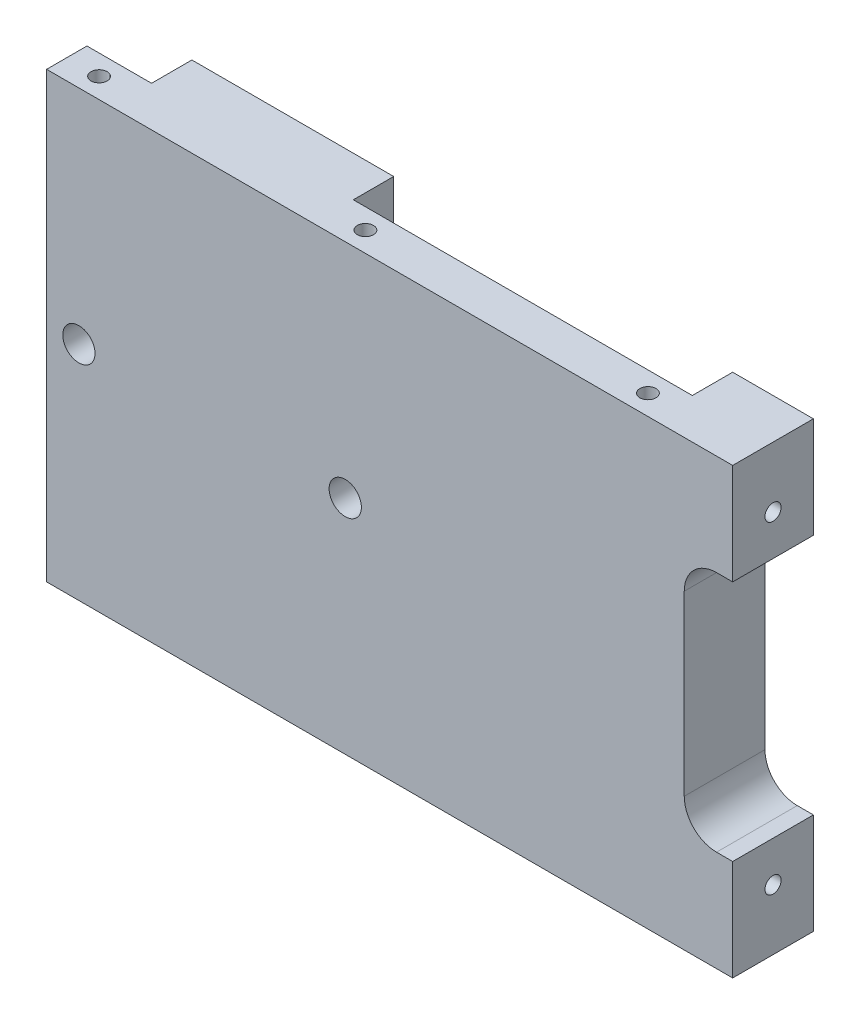
ISO-10303-21;
HEADER;
FILE_DESCRIPTION(('STEP AP214'),'2;1');
FILE_NAME('part.step','',(''),(''),'','','');
FILE_SCHEMA(('AUTOMOTIVE_DESIGN { 1 0 10303 214 1 1 1 1 }'));
ENDSEC;
DATA;
#1=APPLICATION_CONTEXT('core data for automotive mechanical design processes');
#2=APPLICATION_PROTOCOL_DEFINITION('international standard','automotive_design',2000,#1);
#3=PRODUCT_CONTEXT('',#1,'mechanical');
#4=PRODUCT('Part','Part','',(#3));
#5=PRODUCT_RELATED_PRODUCT_CATEGORY('part','',(#4));
#6=PRODUCT_DEFINITION_FORMATION('','',#4);
#7=PRODUCT_DEFINITION_CONTEXT('part definition',#1,'design');
#8=PRODUCT_DEFINITION('design','',#6,#7);
#9=PRODUCT_DEFINITION_SHAPE('','',#8);
#10=(LENGTH_UNIT() NAMED_UNIT(*) SI_UNIT(.MILLI.,.METRE.));
#11=(NAMED_UNIT(*) PLANE_ANGLE_UNIT() SI_UNIT($,.RADIAN.));
#12=(NAMED_UNIT(*) SI_UNIT($,.STERADIAN.) SOLID_ANGLE_UNIT());
#13=UNCERTAINTY_MEASURE_WITH_UNIT(LENGTH_MEASURE(1.E-05),#10,'distance_accuracy_value','');
#14=(GEOMETRIC_REPRESENTATION_CONTEXT(3) GLOBAL_UNCERTAINTY_ASSIGNED_CONTEXT((#13)) GLOBAL_UNIT_ASSIGNED_CONTEXT((#10,
#11,#12)) REPRESENTATION_CONTEXT('',''));
#15=CARTESIAN_POINT('',(0.,0.,0.));
#16=DIRECTION('',(0.,0.,1.));
#17=DIRECTION('',(1.,0.,0.));
#18=AXIS2_PLACEMENT_3D('',#15,#16,#17);
#19=CARTESIAN_POINT('',(85.,-27.5,10.));
#20=DIRECTION('',(-1.,0.,0.));
#21=DIRECTION('',(0.,0.,1.));
#22=AXIS2_PLACEMENT_3D('',#19,#20,#21);
#23=PLANE('',#22);
#24=CARTESIAN_POINT('',(85.,-20.,5.));
#25=DIRECTION('',(1.,0.,0.));
#26=DIRECTION('',(0.,0.,-1.));
#27=AXIS2_PLACEMENT_3D('',#24,#25,#26);
#28=CIRCLE('',#27,0.999999999999997);
#29=CARTESIAN_POINT('',(85.,-20.,4.));
#30=VERTEX_POINT('',#29);
#31=EDGE_CURVE('E326',#30,#30,#28,.T.);
#32=ORIENTED_EDGE('',*,*,#31,.F.);
#33=EDGE_LOOP('',(#32));
#34=FACE_BOUND('',#33,.T.);
#35=DIRECTION('',(0.,1.,0.));
#36=VECTOR('',#35,1.);
#37=CARTESIAN_POINT('',(85.,-27.5,0.));
#38=LINE('',#37,#36);
#39=CARTESIAN_POINT('',(85.,-27.5,0.));
#40=VERTEX_POINT('',#39);
#41=CARTESIAN_POINT('',(85.,-15.,0.));
#42=VERTEX_POINT('',#41);
#43=EDGE_CURVE('E225',#40,#42,#38,.T.);
#44=ORIENTED_EDGE('',*,*,#43,.T.);
#45=DIRECTION('',(0.,0.,1.));
#46=VECTOR('',#45,1.);
#47=CARTESIAN_POINT('',(85.,-15.,0.));
#48=LINE('',#47,#46);
#49=CARTESIAN_POINT('',(85.,-15.,10.));
#50=VERTEX_POINT('',#49);
#51=EDGE_CURVE('E217',#42,#50,#48,.T.);
#52=ORIENTED_EDGE('',*,*,#51,.T.);
#53=DIRECTION('',(0.,1.,0.));
#54=VECTOR('',#53,1.);
#55=CARTESIAN_POINT('',(85.,-27.5,10.));
#56=LINE('',#55,#54);
#57=CARTESIAN_POINT('',(85.,-27.5,10.));
#58=VERTEX_POINT('',#57);
#59=EDGE_CURVE('E425',#58,#50,#56,.T.);
#60=ORIENTED_EDGE('',*,*,#59,.F.);
#61=DIRECTION('',(0.,0.,-1.));
#62=VECTOR('',#61,1.);
#63=CARTESIAN_POINT('',(85.,-27.5,10.));
#64=LINE('',#63,#62);
#65=EDGE_CURVE('E243',#58,#40,#64,.T.);
#66=ORIENTED_EDGE('',*,*,#65,.T.);
#67=EDGE_LOOP('',(#44,#52,#60,#66));
#68=FACE_BOUND('',#67,.T.);
#69=ADVANCED_FACE('F38',(#34,#68),#23,.F.);
#70=CARTESIAN_POINT('',(0.,27.5,10.));
#71=DIRECTION('',(0.,-1.,0.));
#72=DIRECTION('',(0.,0.,-1.));
#73=AXIS2_PLACEMENT_3D('',#70,#71,#72);
#74=PLANE('',#73);
#75=DIRECTION('',(1.,0.,0.));
#76=VECTOR('',#75,1.);
#77=CARTESIAN_POINT('',(33.,27.5,5.));
#78=LINE('',#77,#76);
#79=CARTESIAN_POINT('',(33.,27.5,5.));
#80=VERTEX_POINT('',#79);
#81=CARTESIAN_POINT('',(75.,27.5,5.));
#82=VERTEX_POINT('',#81);
#83=EDGE_CURVE('E388',#80,#82,#78,.T.);
#84=ORIENTED_EDGE('',*,*,#83,.F.);
#85=DIRECTION('',(0.,0.,1.));
#86=VECTOR('',#85,1.);
#87=CARTESIAN_POINT('',(33.,27.5,0.));
#88=LINE('',#87,#86);
#89=CARTESIAN_POINT('',(33.,27.5,0.));
#90=VERTEX_POINT('',#89);
#91=EDGE_CURVE('E253',#90,#80,#88,.T.);
#92=ORIENTED_EDGE('',*,*,#91,.F.);
#93=DIRECTION('',(-1.,0.,0.));
#94=VECTOR('',#93,1.);
#95=CARTESIAN_POINT('',(0.,27.5,0.));
#96=LINE('',#95,#94);
#97=CARTESIAN_POINT('',(8.,27.5,0.));
#98=VERTEX_POINT('',#97);
#99=EDGE_CURVE('E229',#90,#98,#96,.T.);
#100=ORIENTED_EDGE('',*,*,#99,.T.);
#101=DIRECTION('',(0.,0.,-1.));
#102=VECTOR('',#101,1.);
#103=CARTESIAN_POINT('',(8.,27.5,0.));
#104=LINE('',#103,#102);
#105=CARTESIAN_POINT('',(7.99999999999999,27.5,5.));
#106=VERTEX_POINT('',#105);
#107=EDGE_CURVE('E407',#106,#98,#104,.T.);
#108=ORIENTED_EDGE('',*,*,#107,.F.);
#109=DIRECTION('',(1.,0.,0.));
#110=VECTOR('',#109,1.);
#111=CARTESIAN_POINT('',(0.,27.5,5.));
#112=LINE('',#111,#110);
#113=CARTESIAN_POINT('',(0.,27.5,5.));
#114=VERTEX_POINT('',#113);
#115=EDGE_CURVE('E394',#114,#106,#112,.T.);
#116=ORIENTED_EDGE('',*,*,#115,.F.);
#117=DIRECTION('',(0.,0.,-1.));
#118=VECTOR('',#117,1.);
#119=CARTESIAN_POINT('',(0.,27.5,10.));
#120=LINE('',#119,#118);
#121=CARTESIAN_POINT('',(0.,27.5,10.));
#122=VERTEX_POINT('',#121);
#123=EDGE_CURVE('E237',#122,#114,#120,.T.);
#124=ORIENTED_EDGE('',*,*,#123,.F.);
#125=DIRECTION('',(-1.,0.,0.));
#126=VECTOR('',#125,1.);
#127=CARTESIAN_POINT('',(0.,27.5,10.));
#128=LINE('',#127,#126);
#129=CARTESIAN_POINT('',(85.,27.5,10.));
#130=VERTEX_POINT('',#129);
#131=EDGE_CURVE('E241',#130,#122,#128,.T.);
#132=ORIENTED_EDGE('',*,*,#131,.F.);
#133=DIRECTION('',(0.,0.,-1.));
#134=VECTOR('',#133,1.);
#135=CARTESIAN_POINT('',(85.,27.5,10.));
#136=LINE('',#135,#134);
#137=CARTESIAN_POINT('',(85.,27.5,0.));
#138=VERTEX_POINT('',#137);
#139=EDGE_CURVE('E240',#130,#138,#136,.T.);
#140=ORIENTED_EDGE('',*,*,#139,.T.);
#141=CARTESIAN_POINT('',(75.,27.5,0.));
#142=VERTEX_POINT('',#141);
#143=EDGE_CURVE('E224',#138,#142,#96,.T.);
#144=ORIENTED_EDGE('',*,*,#143,.T.);
#145=DIRECTION('',(0.,0.,-1.));
#146=VECTOR('',#145,1.);
#147=CARTESIAN_POINT('',(75.,27.5,0.));
#148=LINE('',#147,#146);
#149=EDGE_CURVE('E379',#82,#142,#148,.T.);
#150=ORIENTED_EDGE('',*,*,#149,.F.);
#151=EDGE_LOOP('',(#84,#92,#100,#108,#116,#124,#132,#140,#144,#150));
#152=FACE_BOUND('',#151,.T.);
#153=CARTESIAN_POINT('',(72.,27.5,7.50000000000001));
#154=DIRECTION('',(0.,1.,0.));
#155=DIRECTION('',(0.,0.,1.));
#156=AXIS2_PLACEMENT_3D('',#153,#154,#155);
#157=CIRCLE('',#156,1.);
#158=CARTESIAN_POINT('',(72.,27.5,8.50000000000001));
#159=VERTEX_POINT('',#158);
#160=EDGE_CURVE('E347',#159,#159,#157,.T.);
#161=ORIENTED_EDGE('',*,*,#160,.F.);
#162=EDGE_LOOP('',(#161));
#163=FACE_BOUND('',#162,.T.);
#164=CARTESIAN_POINT('',(37.,27.5,7.5));
#165=DIRECTION('',(0.,1.,0.));
#166=DIRECTION('',(0.,0.,1.));
#167=AXIS2_PLACEMENT_3D('',#164,#165,#166);
#168=CIRCLE('',#167,1.);
#169=CARTESIAN_POINT('',(37.,27.5,8.5));
#170=VERTEX_POINT('',#169);
#171=EDGE_CURVE('E341',#170,#170,#168,.T.);
#172=ORIENTED_EDGE('',*,*,#171,.F.);
#173=EDGE_LOOP('',(#172));
#174=FACE_BOUND('',#173,.T.);
#175=CARTESIAN_POINT('',(4.,27.5,7.5));
#176=DIRECTION('',(0.,1.,0.));
#177=DIRECTION('',(0.,0.,1.));
#178=AXIS2_PLACEMENT_3D('',#175,#176,#177);
#179=CIRCLE('',#178,0.999999999999998);
#180=CARTESIAN_POINT('',(4.,27.5,8.5));
#181=VERTEX_POINT('',#180);
#182=EDGE_CURVE('E335',#181,#181,#179,.T.);
#183=ORIENTED_EDGE('',*,*,#182,.F.);
#184=EDGE_LOOP('',(#183));
#185=FACE_BOUND('',#184,.T.);
#186=ADVANCED_FACE('F433',(#152,#163,#174,#185),#74,.F.);
#187=CARTESIAN_POINT('',(0.,0.,0.));
#188=DIRECTION('',(0.,0.,-1.));
#189=DIRECTION('',(-1.,0.,0.));
#190=AXIS2_PLACEMENT_3D('',#187,#188,#189);
#191=PLANE('',#190);
#192=DIRECTION('',(0.,1.,0.));
#193=VECTOR('',#192,1.);
#194=CARTESIAN_POINT('',(33.,-27.5,0.));
#195=LINE('',#194,#193);
#196=CARTESIAN_POINT('',(33.,-27.5,0.));
#197=VERTEX_POINT('',#196);
#198=EDGE_CURVE('E392',#197,#90,#195,.T.);
#199=ORIENTED_EDGE('',*,*,#198,.F.);
#200=DIRECTION('',(1.,0.,0.));
#201=VECTOR('',#200,1.);
#202=CARTESIAN_POINT('',(0.,-27.5,0.));
#203=LINE('',#202,#201);
#204=CARTESIAN_POINT('',(8.,-27.5,0.));
#205=VERTEX_POINT('',#204);
#206=EDGE_CURVE('E226',#205,#197,#203,.T.);
#207=ORIENTED_EDGE('',*,*,#206,.F.);
#208=DIRECTION('',(0.,1.,0.));
#209=VECTOR('',#208,1.);
#210=CARTESIAN_POINT('',(8.,-27.5,0.));
#211=LINE('',#210,#209);
#212=EDGE_CURVE('E415',#205,#98,#211,.T.);
#213=ORIENTED_EDGE('',*,*,#212,.T.);
#214=ORIENTED_EDGE('',*,*,#99,.F.);
#215=EDGE_LOOP('',(#199,#207,#213,#214));
#216=FACE_BOUND('',#215,.T.);
#217=ADVANCED_FACE('F461',(#216),#191,.T.);
#218=CARTESIAN_POINT('',(0.,-27.5,10.));
#219=DIRECTION('',(1.,0.,0.));
#220=DIRECTION('',(0.,1.,0.));
#221=AXIS2_PLACEMENT_3D('',#218,#219,#220);
#222=PLANE('',#221);
#223=ORIENTED_EDGE('',*,*,#123,.T.);
#224=DIRECTION('',(0.,1.,0.));
#225=VECTOR('',#224,1.);
#226=CARTESIAN_POINT('',(0.,-27.5,5.));
#227=LINE('',#226,#225);
#228=CARTESIAN_POINT('',(0.,-27.5,5.));
#229=VERTEX_POINT('',#228);
#230=EDGE_CURVE('E410',#229,#114,#227,.T.);
#231=ORIENTED_EDGE('',*,*,#230,.F.);
#232=DIRECTION('',(0.,0.,-1.));
#233=VECTOR('',#232,1.);
#234=CARTESIAN_POINT('',(0.,-27.5,10.));
#235=LINE('',#234,#233);
#236=CARTESIAN_POINT('',(0.,-27.5,10.));
#237=VERTEX_POINT('',#236);
#238=EDGE_CURVE('E246',#237,#229,#235,.T.);
#239=ORIENTED_EDGE('',*,*,#238,.F.);
#240=DIRECTION('',(0.,-1.,0.));
#241=VECTOR('',#240,1.);
#242=CARTESIAN_POINT('',(0.,-27.5,10.));
#243=LINE('',#242,#241);
#244=EDGE_CURVE('E236',#122,#237,#243,.T.);
#245=ORIENTED_EDGE('',*,*,#244,.F.);
#246=EDGE_LOOP('',(#223,#231,#239,#245));
#247=FACE_BOUND('',#246,.T.);
#248=ADVANCED_FACE('F438',(#247),#222,.F.);
#249=CARTESIAN_POINT('',(0.,-27.5,10.));
#250=DIRECTION('',(0.,1.,0.));
#251=DIRECTION('',(0.,0.,1.));
#252=AXIS2_PLACEMENT_3D('',#249,#250,#251);
#253=PLANE('',#252);
#254=CARTESIAN_POINT('',(4.,-27.5,7.5));
#255=DIRECTION('',(0.,-1.,0.));
#256=DIRECTION('',(0.,0.,-1.));
#257=AXIS2_PLACEMENT_3D('',#254,#255,#256);
#258=CIRCLE('',#257,0.999999999999998);
#259=CARTESIAN_POINT('',(4.,-27.5,6.5));
#260=VERTEX_POINT('',#259);
#261=EDGE_CURVE('E353',#260,#260,#258,.T.);
#262=ORIENTED_EDGE('',*,*,#261,.F.);
#263=EDGE_LOOP('',(#262));
#264=FACE_BOUND('',#263,.T.);
#265=CARTESIAN_POINT('',(37.,-27.5,7.5));
#266=DIRECTION('',(0.,-1.,0.));
#267=DIRECTION('',(0.,0.,-1.));
#268=AXIS2_PLACEMENT_3D('',#265,#266,#267);
#269=CIRCLE('',#268,1.);
#270=CARTESIAN_POINT('',(37.,-27.5,6.5));
#271=VERTEX_POINT('',#270);
#272=EDGE_CURVE('E359',#271,#271,#269,.T.);
#273=ORIENTED_EDGE('',*,*,#272,.F.);
#274=EDGE_LOOP('',(#273));
#275=FACE_BOUND('',#274,.T.);
#276=CARTESIAN_POINT('',(72.,-27.5,7.50000000000001));
#277=DIRECTION('',(0.,-1.,0.));
#278=DIRECTION('',(0.,0.,-1.));
#279=AXIS2_PLACEMENT_3D('',#276,#277,#278);
#280=CIRCLE('',#279,1.);
#281=CARTESIAN_POINT('',(72.,-27.5,6.50000000000001));
#282=VERTEX_POINT('',#281);
#283=EDGE_CURVE('E365',#282,#282,#280,.T.);
#284=ORIENTED_EDGE('',*,*,#283,.F.);
#285=EDGE_LOOP('',(#284));
#286=FACE_BOUND('',#285,.T.);
#287=ORIENTED_EDGE('',*,*,#206,.T.);
#288=DIRECTION('',(0.,0.,1.));
#289=VECTOR('',#288,1.);
#290=CARTESIAN_POINT('',(33.,-27.5,0.));
#291=LINE('',#290,#289);
#292=CARTESIAN_POINT('',(33.,-27.5,5.));
#293=VERTEX_POINT('',#292);
#294=EDGE_CURVE('E375',#197,#293,#291,.T.);
#295=ORIENTED_EDGE('',*,*,#294,.T.);
#296=DIRECTION('',(1.,0.,0.));
#297=VECTOR('',#296,1.);
#298=CARTESIAN_POINT('',(33.,-27.5,5.));
#299=LINE('',#298,#297);
#300=CARTESIAN_POINT('',(75.,-27.5,5.));
#301=VERTEX_POINT('',#300);
#302=EDGE_CURVE('E378',#293,#301,#299,.T.);
#303=ORIENTED_EDGE('',*,*,#302,.T.);
#304=DIRECTION('',(0.,0.,-1.));
#305=VECTOR('',#304,1.);
#306=CARTESIAN_POINT('',(75.,-27.5,0.));
#307=LINE('',#306,#305);
#308=CARTESIAN_POINT('',(75.,-27.5,0.));
#309=VERTEX_POINT('',#308);
#310=EDGE_CURVE('E382',#301,#309,#307,.T.);
#311=ORIENTED_EDGE('',*,*,#310,.T.);
#312=EDGE_CURVE('E231',#309,#40,#203,.T.);
#313=ORIENTED_EDGE('',*,*,#312,.T.);
#314=ORIENTED_EDGE('',*,*,#65,.F.);
#315=DIRECTION('',(1.,0.,0.));
#316=VECTOR('',#315,1.);
#317=CARTESIAN_POINT('',(0.,-27.5,10.));
#318=LINE('',#317,#316);
#319=EDGE_CURVE('E423',#237,#58,#318,.T.);
#320=ORIENTED_EDGE('',*,*,#319,.F.);
#321=ORIENTED_EDGE('',*,*,#238,.T.);
#322=DIRECTION('',(1.,0.,0.));
#323=VECTOR('',#322,1.);
#324=CARTESIAN_POINT('',(0.,-27.5,5.));
#325=LINE('',#324,#323);
#326=CARTESIAN_POINT('',(7.99999999999999,-27.5,5.));
#327=VERTEX_POINT('',#326);
#328=EDGE_CURVE('E403',#229,#327,#325,.T.);
#329=ORIENTED_EDGE('',*,*,#328,.T.);
#330=DIRECTION('',(0.,0.,-1.));
#331=VECTOR('',#330,1.);
#332=CARTESIAN_POINT('',(8.,-27.5,0.));
#333=LINE('',#332,#331);
#334=EDGE_CURVE('E406',#327,#205,#333,.T.);
#335=ORIENTED_EDGE('',*,*,#334,.T.);
#336=EDGE_LOOP('',(#287,#295,#303,#311,#313,#314,#320,#321,#329,#335));
#337=FACE_BOUND('',#336,.T.);
#338=ADVANCED_FACE('F440',(#264,#275,#286,#337),#253,.F.);
#339=CARTESIAN_POINT('',(85.,20.,5.00000000000001));
#340=DIRECTION('',(1.,0.,0.));
#341=DIRECTION('',(0.,0.,-1.));
#342=AXIS2_PLACEMENT_3D('',#339,#340,#341);
#343=CIRCLE('',#342,0.999999999999997);
#344=CARTESIAN_POINT('',(85.,20.,4.00000000000001));
#345=VERTEX_POINT('',#344);
#346=EDGE_CURVE('E316',#345,#345,#343,.T.);
#347=ORIENTED_EDGE('',*,*,#346,.F.);
#348=EDGE_LOOP('',(#347));
#349=FACE_BOUND('',#348,.T.);
#350=CARTESIAN_POINT('',(85.,15.,10.));
#351=VERTEX_POINT('',#350);
#352=EDGE_CURVE('E216',#351,#130,#56,.T.);
#353=ORIENTED_EDGE('',*,*,#352,.F.);
#354=DIRECTION('',(0.,0.,1.));
#355=VECTOR('',#354,1.);
#356=CARTESIAN_POINT('',(85.,15.,0.));
#357=LINE('',#356,#355);
#358=CARTESIAN_POINT('',(85.,15.,0.));
#359=VERTEX_POINT('',#358);
#360=EDGE_CURVE('E201',#359,#351,#357,.T.);
#361=ORIENTED_EDGE('',*,*,#360,.F.);
#362=EDGE_CURVE('E214',#359,#138,#38,.T.);
#363=ORIENTED_EDGE('',*,*,#362,.T.);
#364=ORIENTED_EDGE('',*,*,#139,.F.);
#365=EDGE_LOOP('',(#353,#361,#363,#364));
#366=FACE_BOUND('',#365,.T.);
#367=ADVANCED_FACE('F212',(#349,#366),#23,.F.);
#368=CARTESIAN_POINT('',(0.,0.,10.));
#369=DIRECTION('',(0.,0.,-1.));
#370=DIRECTION('',(-1.,0.,0.));
#371=AXIS2_PLACEMENT_3D('',#368,#369,#370);
#372=PLANE('',#371);
#373=CARTESIAN_POINT('',(37.,0.,10.));
#374=DIRECTION('',(0.,0.,1.));
#375=DIRECTION('',(1.,0.,0.));
#376=AXIS2_PLACEMENT_3D('',#373,#374,#375);
#377=CIRCLE('',#376,2.);
#378=CARTESIAN_POINT('',(39.,0.,10.));
#379=VERTEX_POINT('',#378);
#380=EDGE_CURVE('E258',#379,#379,#377,.T.);
#381=ORIENTED_EDGE('',*,*,#380,.F.);
#382=EDGE_LOOP('',(#381));
#383=FACE_BOUND('',#382,.T.);
#384=CARTESIAN_POINT('',(4.,0.,10.));
#385=DIRECTION('',(0.,0.,1.));
#386=DIRECTION('',(1.,0.,0.));
#387=AXIS2_PLACEMENT_3D('',#384,#385,#386);
#388=CIRCLE('',#387,2.);
#389=CARTESIAN_POINT('',(6.00000000000001,0.,10.));
#390=VERTEX_POINT('',#389);
#391=EDGE_CURVE('E254',#390,#390,#388,.T.);
#392=ORIENTED_EDGE('',*,*,#391,.F.);
#393=EDGE_LOOP('',(#392));
#394=FACE_BOUND('',#393,.T.);
#395=ORIENTED_EDGE('',*,*,#59,.T.);
#396=DIRECTION('',(1.,0.,0.));
#397=VECTOR('',#396,1.);
#398=CARTESIAN_POINT('',(85.,-15.,10.));
#399=LINE('',#398,#397);
#400=CARTESIAN_POINT('',(83.,-15.,10.));
#401=VERTEX_POINT('',#400);
#402=EDGE_CURVE('E208',#401,#50,#399,.T.);
#403=ORIENTED_EDGE('',*,*,#402,.F.);
#404=CARTESIAN_POINT('',(83.,-11.,10.));
#405=DIRECTION('',(0.,0.,-1.));
#406=DIRECTION('',(-1.,0.,0.));
#407=AXIS2_PLACEMENT_3D('',#404,#405,#406);
#408=CIRCLE('',#407,4.);
#409=CARTESIAN_POINT('',(79.,-11.,10.));
#410=VERTEX_POINT('',#409);
#411=EDGE_CURVE('E46',#401,#410,#408,.T.);
#412=ORIENTED_EDGE('',*,*,#411,.T.);
#413=DIRECTION('',(0.,-1.,0.));
#414=VECTOR('',#413,1.);
#415=CARTESIAN_POINT('',(79.,-15.,10.));
#416=LINE('',#415,#414);
#417=CARTESIAN_POINT('',(79.,11.,10.));
#418=VERTEX_POINT('',#417);
#419=EDGE_CURVE('E299',#418,#410,#416,.T.);
#420=ORIENTED_EDGE('',*,*,#419,.F.);
#421=CARTESIAN_POINT('',(83.,11.,10.));
#422=DIRECTION('',(0.,0.,-1.));
#423=DIRECTION('',(-1.,0.,0.));
#424=AXIS2_PLACEMENT_3D('',#421,#422,#423);
#425=CIRCLE('',#424,4.);
#426=CARTESIAN_POINT('',(83.,15.,10.));
#427=VERTEX_POINT('',#426);
#428=EDGE_CURVE('E290',#418,#427,#425,.T.);
#429=ORIENTED_EDGE('',*,*,#428,.T.);
#430=DIRECTION('',(-1.,0.,0.));
#431=VECTOR('',#430,1.);
#432=CARTESIAN_POINT('',(85.,15.,10.));
#433=LINE('',#432,#431);
#434=EDGE_CURVE('E304',#351,#427,#433,.T.);
#435=ORIENTED_EDGE('',*,*,#434,.F.);
#436=ORIENTED_EDGE('',*,*,#352,.T.);
#437=ORIENTED_EDGE('',*,*,#131,.T.);
#438=ORIENTED_EDGE('',*,*,#244,.T.);
#439=ORIENTED_EDGE('',*,*,#319,.T.);
#440=EDGE_LOOP('',(#395,#403,#412,#420,#429,#435,#436,#437,#438,#439));
#441=FACE_BOUND('',#440,.T.);
#442=ADVANCED_FACE('F298',(#383,#394,#441),#372,.F.);
#443=DIRECTION('',(0.,-1.,0.));
#444=VECTOR('',#443,1.);
#445=CARTESIAN_POINT('',(79.,-15.,0.));
#446=LINE('',#445,#444);
#447=CARTESIAN_POINT('',(79.,11.,0.));
#448=VERTEX_POINT('',#447);
#449=CARTESIAN_POINT('',(79.,-11.,0.));
#450=VERTEX_POINT('',#449);
#451=EDGE_CURVE('E207',#448,#450,#446,.T.);
#452=ORIENTED_EDGE('',*,*,#451,.T.);
#453=CARTESIAN_POINT('',(83.,-11.,0.));
#454=DIRECTION('',(0.,0.,-1.));
#455=DIRECTION('',(-1.,0.,0.));
#456=AXIS2_PLACEMENT_3D('',#453,#454,#455);
#457=CIRCLE('',#456,4.);
#458=CARTESIAN_POINT('',(83.,-15.,0.));
#459=VERTEX_POINT('',#458);
#460=EDGE_CURVE('E11',#450,#459,#457,.F.);
#461=ORIENTED_EDGE('',*,*,#460,.T.);
#462=DIRECTION('',(1.,0.,0.));
#463=VECTOR('',#462,1.);
#464=CARTESIAN_POINT('',(85.,-15.,0.));
#465=LINE('',#464,#463);
#466=EDGE_CURVE('E218',#459,#42,#465,.T.);
#467=ORIENTED_EDGE('',*,*,#466,.T.);
#468=ORIENTED_EDGE('',*,*,#43,.F.);
#469=ORIENTED_EDGE('',*,*,#312,.F.);
#470=DIRECTION('',(0.,1.,0.));
#471=VECTOR('',#470,1.);
#472=CARTESIAN_POINT('',(75.,-27.5,0.));
#473=LINE('',#472,#471);
#474=EDGE_CURVE('E395',#309,#142,#473,.T.);
#475=ORIENTED_EDGE('',*,*,#474,.T.);
#476=ORIENTED_EDGE('',*,*,#143,.F.);
#477=ORIENTED_EDGE('',*,*,#362,.F.);
#478=DIRECTION('',(-1.,0.,0.));
#479=VECTOR('',#478,1.);
#480=CARTESIAN_POINT('',(85.,15.,0.));
#481=LINE('',#480,#479);
#482=CARTESIAN_POINT('',(83.,15.,0.));
#483=VERTEX_POINT('',#482);
#484=EDGE_CURVE('E197',#359,#483,#481,.T.);
#485=ORIENTED_EDGE('',*,*,#484,.T.);
#486=CARTESIAN_POINT('',(83.,11.,0.));
#487=DIRECTION('',(0.,0.,-1.));
#488=DIRECTION('',(-1.,0.,0.));
#489=AXIS2_PLACEMENT_3D('',#486,#487,#488);
#490=CIRCLE('',#489,4.);
#491=EDGE_CURVE('E292',#483,#448,#490,.F.);
#492=ORIENTED_EDGE('',*,*,#491,.T.);
#493=EDGE_LOOP('',(#452,#461,#467,#468,#469,#475,#476,#477,#485,#492));
#494=FACE_BOUND('',#493,.T.);
#495=ADVANCED_FACE('F221',(#494),#191,.T.);
#496=CARTESIAN_POINT('',(8.,-27.5,0.));
#497=DIRECTION('',(1.,0.,0.));
#498=DIRECTION('',(0.,0.,-1.));
#499=AXIS2_PLACEMENT_3D('',#496,#497,#498);
#500=PLANE('',#499);
#501=ORIENTED_EDGE('',*,*,#107,.T.);
#502=ORIENTED_EDGE('',*,*,#212,.F.);
#503=ORIENTED_EDGE('',*,*,#334,.F.);
#504=DIRECTION('',(0.,1.,0.));
#505=VECTOR('',#504,1.);
#506=CARTESIAN_POINT('',(7.99999999999999,-27.5,5.));
#507=LINE('',#506,#505);
#508=EDGE_CURVE('E418',#327,#106,#507,.T.);
#509=ORIENTED_EDGE('',*,*,#508,.T.);
#510=EDGE_LOOP('',(#501,#502,#503,#509));
#511=FACE_BOUND('',#510,.T.);
#512=ADVANCED_FACE('F464',(#511),#500,.F.);
#513=CARTESIAN_POINT('',(0.,-27.5,5.));
#514=DIRECTION('',(0.,0.,1.));
#515=DIRECTION('',(1.,0.,0.));
#516=AXIS2_PLACEMENT_3D('',#513,#514,#515);
#517=PLANE('',#516);
#518=CARTESIAN_POINT('',(4.,0.,5.));
#519=DIRECTION('',(0.,0.,1.));
#520=DIRECTION('',(1.,0.,0.));
#521=AXIS2_PLACEMENT_3D('',#518,#519,#520);
#522=CIRCLE('',#521,2.);
#523=CARTESIAN_POINT('',(6.00000000000001,0.,5.));
#524=VERTEX_POINT('',#523);
#525=EDGE_CURVE('E250',#524,#524,#522,.T.);
#526=ORIENTED_EDGE('',*,*,#525,.T.);
#527=EDGE_LOOP('',(#526));
#528=FACE_BOUND('',#527,.T.);
#529=ORIENTED_EDGE('',*,*,#115,.T.);
#530=ORIENTED_EDGE('',*,*,#508,.F.);
#531=ORIENTED_EDGE('',*,*,#328,.F.);
#532=ORIENTED_EDGE('',*,*,#230,.T.);
#533=EDGE_LOOP('',(#529,#530,#531,#532));
#534=FACE_BOUND('',#533,.T.);
#535=ADVANCED_FACE('F466',(#528,#534),#517,.F.);
#536=CARTESIAN_POINT('',(33.,-27.5,0.));
#537=DIRECTION('',(-1.,0.,0.));
#538=DIRECTION('',(0.,0.,1.));
#539=AXIS2_PLACEMENT_3D('',#536,#537,#538);
#540=PLANE('',#539);
#541=ORIENTED_EDGE('',*,*,#91,.T.);
#542=DIRECTION('',(0.,1.,0.));
#543=VECTOR('',#542,1.);
#544=CARTESIAN_POINT('',(33.,-27.5,5.));
#545=LINE('',#544,#543);
#546=EDGE_CURVE('E385',#293,#80,#545,.T.);
#547=ORIENTED_EDGE('',*,*,#546,.F.);
#548=ORIENTED_EDGE('',*,*,#294,.F.);
#549=ORIENTED_EDGE('',*,*,#198,.T.);
#550=EDGE_LOOP('',(#541,#547,#548,#549));
#551=FACE_BOUND('',#550,.T.);
#552=ADVANCED_FACE('F457',(#551),#540,.F.);
#553=CARTESIAN_POINT('',(75.,-27.5,0.));
#554=DIRECTION('',(1.,0.,0.));
#555=DIRECTION('',(0.,0.,-1.));
#556=AXIS2_PLACEMENT_3D('',#553,#554,#555);
#557=PLANE('',#556);
#558=DIRECTION('',(0.,1.,0.));
#559=VECTOR('',#558,1.);
#560=CARTESIAN_POINT('',(75.,-27.5,5.));
#561=LINE('',#560,#559);
#562=CARTESIAN_POINT('',(75.,-19.,5.));
#563=VERTEX_POINT('',#562);
#564=CARTESIAN_POINT('',(75.,19.,5.));
#565=VERTEX_POINT('',#564);
#566=EDGE_CURVE('E400',#563,#565,#561,.T.);
#567=ORIENTED_EDGE('',*,*,#566,.T.);
#568=CARTESIAN_POINT('',(75.,20.,5.00000000000001));
#569=DIRECTION('',(1.,0.,0.));
#570=DIRECTION('',(0.,0.,-1.));
#571=AXIS2_PLACEMENT_3D('',#568,#569,#570);
#572=CIRCLE('',#571,0.999999999999997);
#573=CARTESIAN_POINT('',(75.,21.,5.));
#574=VERTEX_POINT('',#573);
#575=EDGE_CURVE('E323',#565,#574,#572,.T.);
#576=ORIENTED_EDGE('',*,*,#575,.T.);
#577=EDGE_CURVE('E401',#574,#82,#561,.T.);
#578=ORIENTED_EDGE('',*,*,#577,.T.);
#579=ORIENTED_EDGE('',*,*,#149,.T.);
#580=ORIENTED_EDGE('',*,*,#474,.F.);
#581=ORIENTED_EDGE('',*,*,#310,.F.);
#582=CARTESIAN_POINT('',(75.,-21.,5.));
#583=VERTEX_POINT('',#582);
#584=EDGE_CURVE('E397',#301,#583,#561,.T.);
#585=ORIENTED_EDGE('',*,*,#584,.T.);
#586=CARTESIAN_POINT('',(75.,-20.,5.));
#587=DIRECTION('',(1.,0.,0.));
#588=DIRECTION('',(0.,0.,-1.));
#589=AXIS2_PLACEMENT_3D('',#586,#587,#588);
#590=CIRCLE('',#589,0.999999999999997);
#591=EDGE_CURVE('E332',#583,#563,#590,.T.);
#592=ORIENTED_EDGE('',*,*,#591,.T.);
#593=EDGE_LOOP('',(#567,#576,#578,#579,#580,#581,#585,#592));
#594=FACE_BOUND('',#593,.T.);
#595=ADVANCED_FACE('F449',(#594),#557,.F.);
#596=CARTESIAN_POINT('',(33.,-27.5,5.));
#597=DIRECTION('',(0.,0.,1.));
#598=DIRECTION('',(1.,0.,0.));
#599=AXIS2_PLACEMENT_3D('',#596,#597,#598);
#600=PLANE('',#599);
#601=CARTESIAN_POINT('',(37.,0.,5.));
#602=DIRECTION('',(0.,0.,1.));
#603=DIRECTION('',(1.,0.,0.));
#604=AXIS2_PLACEMENT_3D('',#601,#602,#603);
#605=CIRCLE('',#604,2.);
#606=CARTESIAN_POINT('',(39.,0.,5.));
#607=VERTEX_POINT('',#606);
#608=EDGE_CURVE('E255',#607,#607,#605,.T.);
#609=ORIENTED_EDGE('',*,*,#608,.T.);
#610=EDGE_LOOP('',(#609));
#611=FACE_BOUND('',#610,.T.);
#612=DIRECTION('',(0.515038074910056,-0.857167300702111,0.));
#613=VECTOR('',#612,1.);
#614=CARTESIAN_POINT('',(72.3991393809724,20.,5.));
#615=LINE('',#614,#613);
#616=CARTESIAN_POINT('',(72.3991393809724,20.,5.));
#617=VERTEX_POINT('',#616);
#618=CARTESIAN_POINT('',(73.,19.,5.));
#619=VERTEX_POINT('',#618);
#620=EDGE_CURVE('E273',#617,#619,#615,.T.);
#621=ORIENTED_EDGE('',*,*,#620,.T.);
#622=DIRECTION('',(1.,0.,0.));
#623=VECTOR('',#622,1.);
#624=CARTESIAN_POINT('',(85.,19.,5.));
#625=LINE('',#624,#623);
#626=EDGE_CURVE('E279',#619,#565,#625,.T.);
#627=ORIENTED_EDGE('',*,*,#626,.T.);
#628=ORIENTED_EDGE('',*,*,#566,.F.);
#629=DIRECTION('',(1.,0.,0.));
#630=VECTOR('',#629,1.);
#631=CARTESIAN_POINT('',(85.,-19.,5.));
#632=LINE('',#631,#630);
#633=CARTESIAN_POINT('',(73.,-19.,5.));
#634=VERTEX_POINT('',#633);
#635=EDGE_CURVE('E264',#563,#634,#632,.F.);
#636=ORIENTED_EDGE('',*,*,#635,.T.);
#637=DIRECTION('',(-0.515038074910056,-0.857167300702111,0.));
#638=VECTOR('',#637,1.);
#639=CARTESIAN_POINT('',(72.3991393809724,-20.,5.));
#640=LINE('',#639,#638);
#641=CARTESIAN_POINT('',(72.3991393809724,-20.,5.));
#642=VERTEX_POINT('',#641);
#643=EDGE_CURVE('E249',#634,#642,#640,.T.);
#644=ORIENTED_EDGE('',*,*,#643,.T.);
#645=DIRECTION('',(0.515038074910056,-0.857167300702111,0.));
#646=VECTOR('',#645,1.);
#647=CARTESIAN_POINT('',(72.3991393809724,-20.,5.));
#648=LINE('',#647,#646);
#649=CARTESIAN_POINT('',(73.,-21.,5.));
#650=VERTEX_POINT('',#649);
#651=EDGE_CURVE('E261',#642,#650,#648,.T.);
#652=ORIENTED_EDGE('',*,*,#651,.T.);
#653=DIRECTION('',(1.,0.,0.));
#654=VECTOR('',#653,1.);
#655=CARTESIAN_POINT('',(85.,-21.,5.));
#656=LINE('',#655,#654);
#657=EDGE_CURVE('E267',#650,#583,#656,.T.);
#658=ORIENTED_EDGE('',*,*,#657,.T.);
#659=ORIENTED_EDGE('',*,*,#584,.F.);
#660=ORIENTED_EDGE('',*,*,#302,.F.);
#661=ORIENTED_EDGE('',*,*,#546,.T.);
#662=ORIENTED_EDGE('',*,*,#83,.T.);
#663=ORIENTED_EDGE('',*,*,#577,.F.);
#664=DIRECTION('',(1.,0.,0.));
#665=VECTOR('',#664,1.);
#666=CARTESIAN_POINT('',(85.,21.,5.));
#667=LINE('',#666,#665);
#668=CARTESIAN_POINT('',(73.,21.,5.));
#669=VERTEX_POINT('',#668);
#670=EDGE_CURVE('E276',#574,#669,#667,.F.);
#671=ORIENTED_EDGE('',*,*,#670,.T.);
#672=DIRECTION('',(-0.515038074910056,-0.857167300702111,0.));
#673=VECTOR('',#672,1.);
#674=CARTESIAN_POINT('',(72.3991393809724,20.,5.));
#675=LINE('',#674,#673);
#676=EDGE_CURVE('E270',#669,#617,#675,.T.);
#677=ORIENTED_EDGE('',*,*,#676,.T.);
#678=EDGE_LOOP('',(#621,#627,#628,#636,#644,#652,#658,#659,#660,#661,#662,#663,#671,#677));
#679=FACE_BOUND('',#678,.T.);
#680=ADVANCED_FACE('F455',(#611,#679),#600,.F.);
#681=CARTESIAN_POINT('',(4.,0.,0.));
#682=DIRECTION('',(0.,0.,1.));
#683=DIRECTION('',(1.,0.,0.));
#684=AXIS2_PLACEMENT_3D('',#681,#682,#683);
#685=CYLINDRICAL_SURFACE('',#684,2.);
#686=ORIENTED_EDGE('',*,*,#391,.T.);
#687=EDGE_LOOP('',(#686));
#688=FACE_BOUND('',#687,.T.);
#689=ORIENTED_EDGE('',*,*,#525,.F.);
#690=EDGE_LOOP('',(#689));
#691=FACE_BOUND('',#690,.T.);
#692=ADVANCED_FACE('F570',(#688,#691),#685,.F.);
#693=CARTESIAN_POINT('',(37.,0.,0.));
#694=DIRECTION('',(0.,0.,1.));
#695=DIRECTION('',(1.,0.,0.));
#696=AXIS2_PLACEMENT_3D('',#693,#694,#695);
#697=CYLINDRICAL_SURFACE('',#696,2.);
#698=ORIENTED_EDGE('',*,*,#380,.T.);
#699=EDGE_LOOP('',(#698));
#700=FACE_BOUND('',#699,.T.);
#701=ORIENTED_EDGE('',*,*,#608,.F.);
#702=EDGE_LOOP('',(#701));
#703=FACE_BOUND('',#702,.T.);
#704=ADVANCED_FACE('F566',(#700,#703),#697,.F.);
#705=CARTESIAN_POINT('',(72.,-12.5,7.50000000000001));
#706=DIRECTION('',(0.,-1.,0.));
#707=DIRECTION('',(0.,0.,-1.));
#708=AXIS2_PLACEMENT_3D('',#705,#706,#707);
#709=CONICAL_SURFACE('',#708,1.,1.02974425867665);
#710=CARTESIAN_POINT('',(72.,-11.8991393809724,7.50000000000001));
#711=VERTEX_POINT('',#710);
#712=VERTEX_LOOP('',#711);
#713=FACE_BOUND('',#712,.T.);
#714=CARTESIAN_POINT('',(72.,-12.5,7.50000000000001));
#715=DIRECTION('',(0.,-1.,0.));
#716=DIRECTION('',(0.,0.,-1.));
#717=AXIS2_PLACEMENT_3D('',#714,#715,#716);
#718=CIRCLE('',#717,1.);
#719=CARTESIAN_POINT('',(72.,-12.5,6.50000000000001));
#720=VERTEX_POINT('',#719);
#721=EDGE_CURVE('E368',#720,#720,#718,.T.);
#722=ORIENTED_EDGE('',*,*,#721,.T.);
#723=EDGE_LOOP('',(#722));
#724=FACE_BOUND('',#723,.T.);
#725=ADVANCED_FACE('F562',(#713,#724),#709,.F.);
#726=CARTESIAN_POINT('',(72.,-27.5,7.50000000000001));
#727=DIRECTION('',(0.,-1.,0.));
#728=DIRECTION('',(0.,0.,-1.));
#729=AXIS2_PLACEMENT_3D('',#726,#727,#728);
#730=CYLINDRICAL_SURFACE('',#729,1.);
#731=ORIENTED_EDGE('',*,*,#721,.F.);
#732=EDGE_LOOP('',(#731));
#733=FACE_BOUND('',#732,.T.);
#734=ORIENTED_EDGE('',*,*,#283,.T.);
#735=EDGE_LOOP('',(#734));
#736=FACE_BOUND('',#735,.T.);
#737=ADVANCED_FACE('F558',(#733,#736),#730,.F.);
#738=CARTESIAN_POINT('',(37.,-12.5,7.5));
#739=DIRECTION('',(0.,-1.,0.));
#740=DIRECTION('',(0.,0.,-1.));
#741=AXIS2_PLACEMENT_3D('',#738,#739,#740);
#742=CONICAL_SURFACE('',#741,0.999999999999994,1.02974425867665);
#743=CARTESIAN_POINT('',(37.,-11.8991393809724,7.5));
#744=VERTEX_POINT('',#743);
#745=VERTEX_LOOP('',#744);
#746=FACE_BOUND('',#745,.T.);
#747=CARTESIAN_POINT('',(37.,-12.5,7.5));
#748=DIRECTION('',(0.,-1.,0.));
#749=DIRECTION('',(0.,0.,-1.));
#750=AXIS2_PLACEMENT_3D('',#747,#748,#749);
#751=CIRCLE('',#750,0.999999999999994);
#752=CARTESIAN_POINT('',(37.,-12.5,6.50000000000001));
#753=VERTEX_POINT('',#752);
#754=EDGE_CURVE('E362',#753,#753,#751,.T.);
#755=ORIENTED_EDGE('',*,*,#754,.T.);
#756=EDGE_LOOP('',(#755));
#757=FACE_BOUND('',#756,.T.);
#758=ADVANCED_FACE('F554',(#746,#757),#742,.F.);
#759=CARTESIAN_POINT('',(37.,-27.5,7.5));
#760=DIRECTION('',(0.,-1.,0.));
#761=DIRECTION('',(0.,0.,-1.));
#762=AXIS2_PLACEMENT_3D('',#759,#760,#761);
#763=CYLINDRICAL_SURFACE('',#762,0.999999999999997);
#764=ORIENTED_EDGE('',*,*,#754,.F.);
#765=EDGE_LOOP('',(#764));
#766=FACE_BOUND('',#765,.T.);
#767=ORIENTED_EDGE('',*,*,#272,.T.);
#768=EDGE_LOOP('',(#767));
#769=FACE_BOUND('',#768,.T.);
#770=ADVANCED_FACE('F550',(#766,#769),#763,.F.);
#771=CARTESIAN_POINT('',(4.,-12.5,7.5));
#772=DIRECTION('',(0.,-1.,0.));
#773=DIRECTION('',(0.,0.,-1.));
#774=AXIS2_PLACEMENT_3D('',#771,#772,#773);
#775=CONICAL_SURFACE('',#774,0.999999999999997,1.02974425867665);
#776=CARTESIAN_POINT('',(4.,-11.8991393809724,7.5));
#777=VERTEX_POINT('',#776);
#778=VERTEX_LOOP('',#777);
#779=FACE_BOUND('',#778,.T.);
#780=CARTESIAN_POINT('',(4.,-12.5,7.5));
#781=DIRECTION('',(0.,-1.,0.));
#782=DIRECTION('',(0.,0.,-1.));
#783=AXIS2_PLACEMENT_3D('',#780,#781,#782);
#784=CIRCLE('',#783,0.999999999999997);
#785=CARTESIAN_POINT('',(4.,-12.5,6.5));
#786=VERTEX_POINT('',#785);
#787=EDGE_CURVE('E356',#786,#786,#784,.T.);
#788=ORIENTED_EDGE('',*,*,#787,.T.);
#789=EDGE_LOOP('',(#788));
#790=FACE_BOUND('',#789,.T.);
#791=ADVANCED_FACE('F546',(#779,#790),#775,.F.);
#792=CARTESIAN_POINT('',(4.,-27.5,7.5));
#793=DIRECTION('',(0.,-1.,0.));
#794=DIRECTION('',(0.,0.,-1.));
#795=AXIS2_PLACEMENT_3D('',#792,#793,#794);
#796=CYLINDRICAL_SURFACE('',#795,0.999999999999997);
#797=ORIENTED_EDGE('',*,*,#787,.F.);
#798=EDGE_LOOP('',(#797));
#799=FACE_BOUND('',#798,.T.);
#800=ORIENTED_EDGE('',*,*,#261,.T.);
#801=EDGE_LOOP('',(#800));
#802=FACE_BOUND('',#801,.T.);
#803=ADVANCED_FACE('F542',(#799,#802),#796,.F.);
#804=CARTESIAN_POINT('',(72.,12.5,7.50000000000001));
#805=DIRECTION('',(0.,1.,0.));
#806=DIRECTION('',(0.,0.,1.));
#807=AXIS2_PLACEMENT_3D('',#804,#805,#806);
#808=CONICAL_SURFACE('',#807,1.,1.02974425867665);
#809=CARTESIAN_POINT('',(72.,11.8991393809724,7.50000000000001));
#810=VERTEX_POINT('',#809);
#811=VERTEX_LOOP('',#810);
#812=FACE_BOUND('',#811,.T.);
#813=CARTESIAN_POINT('',(72.,12.5,7.50000000000001));
#814=DIRECTION('',(0.,1.,0.));
#815=DIRECTION('',(0.,0.,1.));
#816=AXIS2_PLACEMENT_3D('',#813,#814,#815);
#817=CIRCLE('',#816,1.);
#818=CARTESIAN_POINT('',(72.,12.5,8.50000000000001));
#819=VERTEX_POINT('',#818);
#820=EDGE_CURVE('E350',#819,#819,#817,.T.);
#821=ORIENTED_EDGE('',*,*,#820,.T.);
#822=EDGE_LOOP('',(#821));
#823=FACE_BOUND('',#822,.T.);
#824=ADVANCED_FACE('F538',(#812,#823),#808,.F.);
#825=CARTESIAN_POINT('',(72.,27.5,7.50000000000001));
#826=DIRECTION('',(0.,1.,0.));
#827=DIRECTION('',(0.,0.,1.));
#828=AXIS2_PLACEMENT_3D('',#825,#826,#827);
#829=CYLINDRICAL_SURFACE('',#828,1.);
#830=ORIENTED_EDGE('',*,*,#820,.F.);
#831=EDGE_LOOP('',(#830));
#832=FACE_BOUND('',#831,.T.);
#833=ORIENTED_EDGE('',*,*,#160,.T.);
#834=EDGE_LOOP('',(#833));
#835=FACE_BOUND('',#834,.T.);
#836=ADVANCED_FACE('F534',(#832,#835),#829,.F.);
#837=CARTESIAN_POINT('',(37.,12.5,7.5));
#838=DIRECTION('',(0.,1.,0.));
#839=DIRECTION('',(0.,0.,1.));
#840=AXIS2_PLACEMENT_3D('',#837,#838,#839);
#841=CONICAL_SURFACE('',#840,0.999999999999994,1.02974425867665);
#842=CARTESIAN_POINT('',(37.,11.8991393809724,7.5));
#843=VERTEX_POINT('',#842);
#844=VERTEX_LOOP('',#843);
#845=FACE_BOUND('',#844,.T.);
#846=CARTESIAN_POINT('',(37.,12.5,7.5));
#847=DIRECTION('',(0.,1.,0.));
#848=DIRECTION('',(0.,0.,1.));
#849=AXIS2_PLACEMENT_3D('',#846,#847,#848);
#850=CIRCLE('',#849,0.999999999999994);
#851=CARTESIAN_POINT('',(37.,12.5,8.5));
#852=VERTEX_POINT('',#851);
#853=EDGE_CURVE('E344',#852,#852,#850,.T.);
#854=ORIENTED_EDGE('',*,*,#853,.T.);
#855=EDGE_LOOP('',(#854));
#856=FACE_BOUND('',#855,.T.);
#857=ADVANCED_FACE('F530',(#845,#856),#841,.F.);
#858=CARTESIAN_POINT('',(37.,27.5,7.5));
#859=DIRECTION('',(0.,1.,0.));
#860=DIRECTION('',(0.,0.,1.));
#861=AXIS2_PLACEMENT_3D('',#858,#859,#860);
#862=CYLINDRICAL_SURFACE('',#861,0.999999999999997);
#863=ORIENTED_EDGE('',*,*,#853,.F.);
#864=EDGE_LOOP('',(#863));
#865=FACE_BOUND('',#864,.T.);
#866=ORIENTED_EDGE('',*,*,#171,.T.);
#867=EDGE_LOOP('',(#866));
#868=FACE_BOUND('',#867,.T.);
#869=ADVANCED_FACE('F526',(#865,#868),#862,.F.);
#870=CARTESIAN_POINT('',(4.,12.5,7.5));
#871=DIRECTION('',(0.,1.,0.));
#872=DIRECTION('',(0.,0.,1.));
#873=AXIS2_PLACEMENT_3D('',#870,#871,#872);
#874=CONICAL_SURFACE('',#873,0.999999999999997,1.02974425867665);
#875=CARTESIAN_POINT('',(4.,11.8991393809724,7.5));
#876=VERTEX_POINT('',#875);
#877=VERTEX_LOOP('',#876);
#878=FACE_BOUND('',#877,.T.);
#879=CARTESIAN_POINT('',(4.,12.5,7.5));
#880=DIRECTION('',(0.,1.,0.));
#881=DIRECTION('',(0.,0.,1.));
#882=AXIS2_PLACEMENT_3D('',#879,#880,#881);
#883=CIRCLE('',#882,0.999999999999997);
#884=CARTESIAN_POINT('',(4.,12.5,8.5));
#885=VERTEX_POINT('',#884);
#886=EDGE_CURVE('E338',#885,#885,#883,.T.);
#887=ORIENTED_EDGE('',*,*,#886,.T.);
#888=EDGE_LOOP('',(#887));
#889=FACE_BOUND('',#888,.T.);
#890=ADVANCED_FACE('F522',(#878,#889),#874,.F.);
#891=CARTESIAN_POINT('',(4.,27.5,7.5));
#892=DIRECTION('',(0.,1.,0.));
#893=DIRECTION('',(0.,0.,1.));
#894=AXIS2_PLACEMENT_3D('',#891,#892,#893);
#895=CYLINDRICAL_SURFACE('',#894,0.999999999999997);
#896=ORIENTED_EDGE('',*,*,#886,.F.);
#897=EDGE_LOOP('',(#896));
#898=FACE_BOUND('',#897,.T.);
#899=ORIENTED_EDGE('',*,*,#182,.T.);
#900=EDGE_LOOP('',(#899));
#901=FACE_BOUND('',#900,.T.);
#902=ADVANCED_FACE('F515',(#898,#901),#895,.F.);
#903=CARTESIAN_POINT('',(85.,-20.,5.));
#904=DIRECTION('',(1.,0.,0.));
#905=DIRECTION('',(0.,0.,-1.));
#906=AXIS2_PLACEMENT_3D('',#903,#904,#905);
#907=CYLINDRICAL_SURFACE('',#906,0.999999999999997);
#908=ORIENTED_EDGE('',*,*,#31,.T.);
#909=EDGE_LOOP('',(#908));
#910=FACE_BOUND('',#909,.T.);
#911=CARTESIAN_POINT('',(73.,-20.,5.));
#912=DIRECTION('',(1.,0.,0.));
#913=DIRECTION('',(0.,0.,-1.));
#914=AXIS2_PLACEMENT_3D('',#911,#912,#913);
#915=CIRCLE('',#914,0.999999999999997);
#916=EDGE_CURVE('E329',#634,#650,#915,.T.);
#917=ORIENTED_EDGE('',*,*,#916,.F.);
#918=ORIENTED_EDGE('',*,*,#635,.F.);
#919=ORIENTED_EDGE('',*,*,#591,.F.);
#920=ORIENTED_EDGE('',*,*,#657,.F.);
#921=EDGE_LOOP('',(#917,#918,#919,#920));
#922=FACE_BOUND('',#921,.T.);
#923=ADVANCED_FACE('F512',(#910,#922),#907,.F.);
#924=CARTESIAN_POINT('',(73.,-20.,5.));
#925=DIRECTION('',(1.,0.,0.));
#926=DIRECTION('',(0.,0.,-1.));
#927=AXIS2_PLACEMENT_3D('',#924,#925,#926);
#928=CONICAL_SURFACE('',#927,0.999999999999997,1.02974425867665);
#929=ORIENTED_EDGE('',*,*,#643,.F.);
#930=ORIENTED_EDGE('',*,*,#916,.T.);
#931=ORIENTED_EDGE('',*,*,#651,.F.);
#932=EDGE_LOOP('',(#929,#930,#931));
#933=FACE_BOUND('',#932,.T.);
#934=ADVANCED_FACE('F500',(#933),#928,.F.);
#935=CARTESIAN_POINT('',(85.,20.,5.00000000000001));
#936=DIRECTION('',(1.,0.,0.));
#937=DIRECTION('',(0.,0.,-1.));
#938=AXIS2_PLACEMENT_3D('',#935,#936,#937);
#939=CYLINDRICAL_SURFACE('',#938,0.999999999999997);
#940=ORIENTED_EDGE('',*,*,#346,.T.);
#941=EDGE_LOOP('',(#940));
#942=FACE_BOUND('',#941,.T.);
#943=CARTESIAN_POINT('',(73.,20.,5.00000000000001));
#944=DIRECTION('',(1.,0.,0.));
#945=DIRECTION('',(0.,0.,-1.));
#946=AXIS2_PLACEMENT_3D('',#943,#944,#945);
#947=CIRCLE('',#946,0.999999999999997);
#948=EDGE_CURVE('E320',#669,#619,#947,.T.);
#949=ORIENTED_EDGE('',*,*,#948,.F.);
#950=ORIENTED_EDGE('',*,*,#670,.F.);
#951=ORIENTED_EDGE('',*,*,#575,.F.);
#952=ORIENTED_EDGE('',*,*,#626,.F.);
#953=EDGE_LOOP('',(#949,#950,#951,#952));
#954=FACE_BOUND('',#953,.T.);
#955=ADVANCED_FACE('F496',(#942,#954),#939,.F.);
#956=CARTESIAN_POINT('',(73.,20.,5.00000000000001));
#957=DIRECTION('',(1.,0.,0.));
#958=DIRECTION('',(0.,0.,-1.));
#959=AXIS2_PLACEMENT_3D('',#956,#957,#958);
#960=CONICAL_SURFACE('',#959,0.999999999999997,1.02974425867665);
#961=ORIENTED_EDGE('',*,*,#676,.F.);
#962=ORIENTED_EDGE('',*,*,#948,.T.);
#963=ORIENTED_EDGE('',*,*,#620,.F.);
#964=EDGE_LOOP('',(#961,#962,#963));
#965=FACE_BOUND('',#964,.T.);
#966=ADVANCED_FACE('F499',(#965),#960,.F.);
#967=CARTESIAN_POINT('',(85.,-15.,0.));
#968=DIRECTION('',(0.,-1.,0.));
#969=DIRECTION('',(1.,0.,0.));
#970=AXIS2_PLACEMENT_3D('',#967,#968,#969);
#971=PLANE('',#970);
#972=ORIENTED_EDGE('',*,*,#466,.F.);
#973=DIRECTION('',(0.,0.,1.));
#974=VECTOR('',#973,1.);
#975=CARTESIAN_POINT('',(83.,-15.,10.));
#976=LINE('',#975,#974);
#977=EDGE_CURVE('E288',#459,#401,#976,.T.);
#978=ORIENTED_EDGE('',*,*,#977,.T.);
#979=ORIENTED_EDGE('',*,*,#402,.T.);
#980=ORIENTED_EDGE('',*,*,#51,.F.);
#981=EDGE_LOOP('',(#972,#978,#979,#980));
#982=FACE_BOUND('',#981,.T.);
#983=ADVANCED_FACE('F307',(#982),#971,.F.);
#984=CARTESIAN_POINT('',(79.,-15.,0.));
#985=DIRECTION('',(-1.,0.,0.));
#986=DIRECTION('',(0.,0.,1.));
#987=AXIS2_PLACEMENT_3D('',#984,#985,#986);
#988=PLANE('',#987);
#989=ORIENTED_EDGE('',*,*,#451,.F.);
#990=DIRECTION('',(0.,0.,1.));
#991=VECTOR('',#990,1.);
#992=CARTESIAN_POINT('',(79.,11.,10.));
#993=LINE('',#992,#991);
#994=EDGE_CURVE('E284',#448,#418,#993,.T.);
#995=ORIENTED_EDGE('',*,*,#994,.T.);
#996=ORIENTED_EDGE('',*,*,#419,.T.);
#997=DIRECTION('',(0.,0.,1.));
#998=VECTOR('',#997,1.);
#999=CARTESIAN_POINT('',(79.,-11.,0.));
#1000=LINE('',#999,#998);
#1001=EDGE_CURVE('E282',#410,#450,#1000,.F.);
#1002=ORIENTED_EDGE('',*,*,#1001,.T.);
#1003=EDGE_LOOP('',(#989,#995,#996,#1002));
#1004=FACE_BOUND('',#1003,.T.);
#1005=ADVANCED_FACE('F302',(#1004),#988,.F.);
#1006=CARTESIAN_POINT('',(85.,15.,0.));
#1007=DIRECTION('',(0.,1.,0.));
#1008=DIRECTION('',(-1.,0.,0.));
#1009=AXIS2_PLACEMENT_3D('',#1006,#1007,#1008);
#1010=PLANE('',#1009);
#1011=ORIENTED_EDGE('',*,*,#434,.T.);
#1012=DIRECTION('',(0.,0.,1.));
#1013=VECTOR('',#1012,1.);
#1014=CARTESIAN_POINT('',(83.,15.,0.));
#1015=LINE('',#1014,#1013);
#1016=EDGE_CURVE('E204',#427,#483,#1015,.F.);
#1017=ORIENTED_EDGE('',*,*,#1016,.T.);
#1018=ORIENTED_EDGE('',*,*,#484,.F.);
#1019=ORIENTED_EDGE('',*,*,#360,.T.);
#1020=EDGE_LOOP('',(#1011,#1017,#1018,#1019));
#1021=FACE_BOUND('',#1020,.T.);
#1022=ADVANCED_FACE('F200',(#1021),#1010,.F.);
#1023=CARTESIAN_POINT('',(83.,11.,0.));
#1024=DIRECTION('',(0.,0.,-1.));
#1025=DIRECTION('',(-1.,0.,0.));
#1026=AXIS2_PLACEMENT_3D('',#1023,#1024,#1025);
#1027=CYLINDRICAL_SURFACE('',#1026,4.);
#1028=ORIENTED_EDGE('',*,*,#491,.F.);
#1029=ORIENTED_EDGE('',*,*,#1016,.F.);
#1030=ORIENTED_EDGE('',*,*,#428,.F.);
#1031=ORIENTED_EDGE('',*,*,#994,.F.);
#1032=EDGE_LOOP('',(#1028,#1029,#1030,#1031));
#1033=FACE_BOUND('',#1032,.T.);
#1034=ADVANCED_FACE('F800',(#1033),#1027,.F.);
#1035=CARTESIAN_POINT('',(83.,-11.,0.));
#1036=DIRECTION('',(0.,0.,-1.));
#1037=DIRECTION('',(-1.,0.,0.));
#1038=AXIS2_PLACEMENT_3D('',#1035,#1036,#1037);
#1039=CYLINDRICAL_SURFACE('',#1038,4.);
#1040=ORIENTED_EDGE('',*,*,#460,.F.);
#1041=ORIENTED_EDGE('',*,*,#1001,.F.);
#1042=ORIENTED_EDGE('',*,*,#411,.F.);
#1043=ORIENTED_EDGE('',*,*,#977,.F.);
#1044=EDGE_LOOP('',(#1040,#1041,#1042,#1043));
#1045=FACE_BOUND('',#1044,.T.);
#1046=ADVANCED_FACE('F40',(#1045),#1039,.F.);
#1047=CLOSED_SHELL('',(#69,#186,#217,#248,#338,#367,#442,#495,#512,#535,#552,#595,#680,#692,
#704,#725,#737,#758,#770,#791,#803,#824,#836,#857,#869,#890,#902,#923,#934,#955,#966,#983,#1005,
#1022,#1034,#1046));
#1048=MANIFOLD_SOLID_BREP('B2',#1047);
#1049=ADVANCED_BREP_SHAPE_REPRESENTATION('',(#18,#1048),#14);
#1050=SHAPE_DEFINITION_REPRESENTATION(#9,#1049);
ENDSEC;
END-ISO-10303-21;
